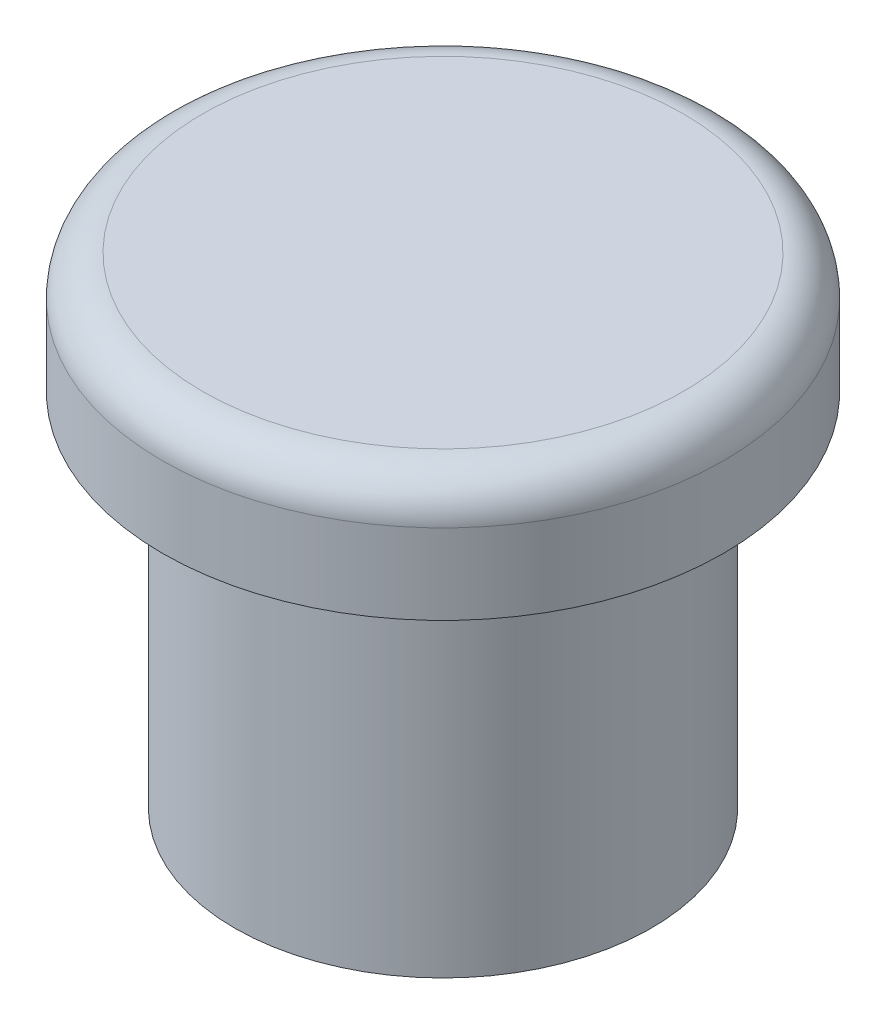
ISO-10303-21;
HEADER;
FILE_DESCRIPTION(('STEP AP214'),'2;1');
FILE_NAME('part.step','',(''),(''),'','','');
FILE_SCHEMA(('AUTOMOTIVE_DESIGN { 1 0 10303 214 1 1 1 1 }'));
ENDSEC;
DATA;
#1=APPLICATION_CONTEXT('core data for automotive mechanical design processes');
#2=APPLICATION_PROTOCOL_DEFINITION('international standard','automotive_design',2000,#1);
#3=PRODUCT_CONTEXT('',#1,'mechanical');
#4=PRODUCT('Part','Part','',(#3));
#5=PRODUCT_RELATED_PRODUCT_CATEGORY('part','',(#4));
#6=PRODUCT_DEFINITION_FORMATION('','',#4);
#7=PRODUCT_DEFINITION_CONTEXT('part definition',#1,'design');
#8=PRODUCT_DEFINITION('design','',#6,#7);
#9=PRODUCT_DEFINITION_SHAPE('','',#8);
#10=(LENGTH_UNIT() NAMED_UNIT(*) SI_UNIT(.MILLI.,.METRE.));
#11=(NAMED_UNIT(*) PLANE_ANGLE_UNIT() SI_UNIT($,.RADIAN.));
#12=(NAMED_UNIT(*) SI_UNIT($,.STERADIAN.) SOLID_ANGLE_UNIT());
#13=UNCERTAINTY_MEASURE_WITH_UNIT(LENGTH_MEASURE(1.E-05),#10,'distance_accuracy_value','');
#14=(GEOMETRIC_REPRESENTATION_CONTEXT(3) GLOBAL_UNCERTAINTY_ASSIGNED_CONTEXT((#13)) GLOBAL_UNIT_ASSIGNED_CONTEXT((#10,
#11,#12)) REPRESENTATION_CONTEXT('',''));
#15=CARTESIAN_POINT('',(0.,0.,0.));
#16=DIRECTION('',(0.,0.,1.));
#17=DIRECTION('',(1.,0.,0.));
#18=AXIS2_PLACEMENT_3D('',#15,#16,#17);
#19=CARTESIAN_POINT('',(0.,0.,0.));
#20=DIRECTION('',(0.,1.,0.));
#21=DIRECTION('',(0.,0.,1.));
#22=AXIS2_PLACEMENT_3D('',#19,#20,#21);
#23=PLANE('',#22);
#24=CARTESIAN_POINT('',(0.,0.,0.));
#25=DIRECTION('',(0.,1.,0.));
#26=DIRECTION('',(0.,0.,1.));
#27=AXIS2_PLACEMENT_3D('',#24,#25,#26);
#28=CIRCLE('',#27,2.6);
#29=CARTESIAN_POINT('',(0.,0.,2.6));
#30=VERTEX_POINT('',#29);
#31=EDGE_CURVE('E47',#30,#30,#28,.T.);
#32=ORIENTED_EDGE('',*,*,#31,.F.);
#33=EDGE_LOOP('',(#32));
#34=FACE_BOUND('',#33,.T.);
#35=CARTESIAN_POINT('',(0.,0.,0.));
#36=DIRECTION('',(0.,1.,0.));
#37=DIRECTION('',(0.,0.,1.));
#38=AXIS2_PLACEMENT_3D('',#35,#36,#37);
#39=CIRCLE('',#38,1.95);
#40=CARTESIAN_POINT('',(0.,0.,1.95));
#41=VERTEX_POINT('',#40);
#42=EDGE_CURVE('E51',#41,#41,#39,.T.);
#43=ORIENTED_EDGE('',*,*,#42,.T.);
#44=EDGE_LOOP('',(#43));
#45=FACE_BOUND('',#44,.T.);
#46=ADVANCED_FACE('F32',(#34,#45),#23,.F.);
#47=CARTESIAN_POINT('',(0.,4.5,0.));
#48=DIRECTION('',(0.,-1.,0.));
#49=DIRECTION('',(0.,0.,-1.));
#50=AXIS2_PLACEMENT_3D('',#47,#48,#49);
#51=CYLINDRICAL_SURFACE('',#50,2.6);
#52=CARTESIAN_POINT('',(0.,4.5,0.));
#53=DIRECTION('',(0.,1.,0.));
#54=DIRECTION('',(0.,0.,1.));
#55=AXIS2_PLACEMENT_3D('',#52,#53,#54);
#56=CIRCLE('',#55,2.6);
#57=CARTESIAN_POINT('',(0.,4.5,2.6));
#58=VERTEX_POINT('',#57);
#59=EDGE_CURVE('E43',#58,#58,#56,.T.);
#60=ORIENTED_EDGE('',*,*,#59,.F.);
#61=EDGE_LOOP('',(#60));
#62=FACE_BOUND('',#61,.T.);
#63=ORIENTED_EDGE('',*,*,#31,.T.);
#64=EDGE_LOOP('',(#63));
#65=FACE_BOUND('',#64,.T.);
#66=ADVANCED_FACE('F81',(#62,#65),#51,.T.);
#67=CARTESIAN_POINT('',(0.,4.5,0.));
#68=DIRECTION('',(0.,-1.,0.));
#69=DIRECTION('',(0.,0.,-1.));
#70=AXIS2_PLACEMENT_3D('',#67,#68,#69);
#71=CYLINDRICAL_SURFACE('',#70,1.95);
#72=CARTESIAN_POINT('',(0.,4.5,0.));
#73=DIRECTION('',(0.,1.,0.));
#74=DIRECTION('',(0.,0.,1.));
#75=AXIS2_PLACEMENT_3D('',#72,#73,#74);
#76=CIRCLE('',#75,1.95);
#77=CARTESIAN_POINT('',(0.,4.5,1.95));
#78=VERTEX_POINT('',#77);
#79=EDGE_CURVE('E55',#78,#78,#76,.T.);
#80=ORIENTED_EDGE('',*,*,#79,.T.);
#81=EDGE_LOOP('',(#80));
#82=FACE_BOUND('',#81,.T.);
#83=ORIENTED_EDGE('',*,*,#42,.F.);
#84=EDGE_LOOP('',(#83));
#85=FACE_BOUND('',#84,.T.);
#86=ADVANCED_FACE('F78',(#82,#85),#71,.F.);
#87=CARTESIAN_POINT('',(0.,4.5,0.));
#88=DIRECTION('',(0.,1.,0.));
#89=DIRECTION('',(0.,0.,1.));
#90=AXIS2_PLACEMENT_3D('',#87,#88,#89);
#91=PLANE('',#90);
#92=ORIENTED_EDGE('',*,*,#79,.F.);
#93=EDGE_LOOP('',(#92));
#94=FACE_BOUND('',#93,.T.);
#95=ADVANCED_FACE('F69',(#94),#91,.F.);
#96=CARTESIAN_POINT('',(0.,6.,0.));
#97=DIRECTION('',(0.,-1.,0.));
#98=DIRECTION('',(0.,0.,-1.));
#99=AXIS2_PLACEMENT_3D('',#96,#97,#98);
#100=CYLINDRICAL_SURFACE('',#99,3.5);
#101=CARTESIAN_POINT('',(0.,5.5,0.));
#102=DIRECTION('',(0.,1.,0.));
#103=DIRECTION('',(0.,0.,1.));
#104=AXIS2_PLACEMENT_3D('',#101,#102,#103);
#105=CIRCLE('',#104,3.5);
#106=CARTESIAN_POINT('',(0.,5.5,3.5));
#107=VERTEX_POINT('',#106);
#108=EDGE_CURVE('E10',#107,#107,#105,.F.);
#109=ORIENTED_EDGE('',*,*,#108,.T.);
#110=EDGE_LOOP('',(#109));
#111=FACE_BOUND('',#110,.T.);
#112=CARTESIAN_POINT('',(0.,4.5,0.));
#113=DIRECTION('',(0.,1.,0.));
#114=DIRECTION('',(0.,0.,1.));
#115=AXIS2_PLACEMENT_3D('',#112,#113,#114);
#116=CIRCLE('',#115,3.5);
#117=CARTESIAN_POINT('',(0.,4.5,3.5));
#118=VERTEX_POINT('',#117);
#119=EDGE_CURVE('E58',#118,#118,#116,.T.);
#120=ORIENTED_EDGE('',*,*,#119,.T.);
#121=EDGE_LOOP('',(#120));
#122=FACE_BOUND('',#121,.T.);
#123=ADVANCED_FACE('F62',(#111,#122),#100,.T.);
#124=CARTESIAN_POINT('',(0.,6.,0.));
#125=DIRECTION('',(0.,1.,0.));
#126=DIRECTION('',(0.,0.,1.));
#127=AXIS2_PLACEMENT_3D('',#124,#125,#126);
#128=PLANE('',#127);
#129=CARTESIAN_POINT('',(0.,6.,0.));
#130=DIRECTION('',(0.,1.,0.));
#131=DIRECTION('',(0.,0.,1.));
#132=AXIS2_PLACEMENT_3D('',#129,#130,#131);
#133=CIRCLE('',#132,3.);
#134=CARTESIAN_POINT('',(0.,6.,3.));
#135=VERTEX_POINT('',#134);
#136=EDGE_CURVE('E39',#135,#135,#133,.T.);
#137=ORIENTED_EDGE('',*,*,#136,.T.);
#138=EDGE_LOOP('',(#137));
#139=FACE_BOUND('',#138,.T.);
#140=ADVANCED_FACE('F66',(#139),#128,.T.);
#141=ORIENTED_EDGE('',*,*,#59,.T.);
#142=EDGE_LOOP('',(#141));
#143=FACE_BOUND('',#142,.T.);
#144=ORIENTED_EDGE('',*,*,#119,.F.);
#145=EDGE_LOOP('',(#144));
#146=FACE_BOUND('',#145,.T.);
#147=ADVANCED_FACE('F64',(#143,#146),#91,.F.);
#148=CARTESIAN_POINT('',(0.,5.5,0.));
#149=DIRECTION('',(0.,1.,0.));
#150=DIRECTION('',(0.,0.,1.));
#151=AXIS2_PLACEMENT_3D('',#148,#149,#150);
#152=TOROIDAL_SURFACE('',#151,3.,0.5);
#153=ORIENTED_EDGE('',*,*,#108,.F.);
#154=EDGE_LOOP('',(#153));
#155=FACE_BOUND('',#154,.T.);
#156=ORIENTED_EDGE('',*,*,#136,.F.);
#157=EDGE_LOOP('',(#156));
#158=FACE_BOUND('',#157,.T.);
#159=ADVANCED_FACE('F34',(#155,#158),#152,.T.);
#160=CLOSED_SHELL('',(#46,#66,#86,#95,#123,#140,#147,#159));
#161=MANIFOLD_SOLID_BREP('B2',#160);
#162=ADVANCED_BREP_SHAPE_REPRESENTATION('',(#18,#161),#14);
#163=SHAPE_DEFINITION_REPRESENTATION(#9,#162);
ENDSEC;
END-ISO-10303-21;
